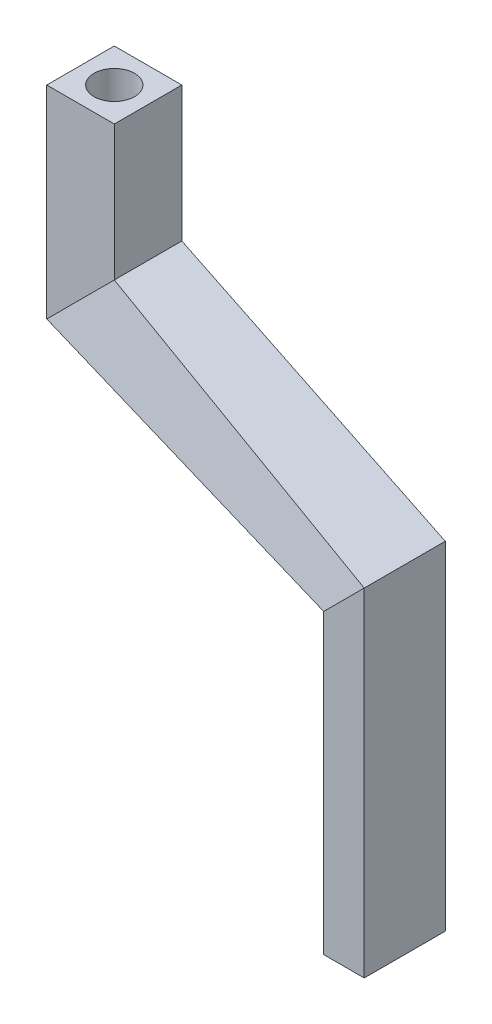
ISO-10303-21;
HEADER;
FILE_DESCRIPTION(('STEP AP214'),'2;1');
FILE_NAME('part.step','',(''),(''),'','','');
FILE_SCHEMA(('AUTOMOTIVE_DESIGN { 1 0 10303 214 1 1 1 1 }'));
ENDSEC;
DATA;
#1=APPLICATION_CONTEXT('core data for automotive mechanical design processes');
#2=APPLICATION_PROTOCOL_DEFINITION('international standard','automotive_design',2000,#1);
#3=PRODUCT_CONTEXT('',#1,'mechanical');
#4=PRODUCT('Part','Part','',(#3));
#5=PRODUCT_RELATED_PRODUCT_CATEGORY('part','',(#4));
#6=PRODUCT_DEFINITION_FORMATION('','',#4);
#7=PRODUCT_DEFINITION_CONTEXT('part definition',#1,'design');
#8=PRODUCT_DEFINITION('design','',#6,#7);
#9=PRODUCT_DEFINITION_SHAPE('','',#8);
#10=(LENGTH_UNIT() NAMED_UNIT(*) SI_UNIT(.MILLI.,.METRE.));
#11=(NAMED_UNIT(*) PLANE_ANGLE_UNIT() SI_UNIT($,.RADIAN.));
#12=(NAMED_UNIT(*) SI_UNIT($,.STERADIAN.) SOLID_ANGLE_UNIT());
#13=UNCERTAINTY_MEASURE_WITH_UNIT(LENGTH_MEASURE(1.E-05),#10,'distance_accuracy_value','');
#14=(GEOMETRIC_REPRESENTATION_CONTEXT(3) GLOBAL_UNCERTAINTY_ASSIGNED_CONTEXT((#13)) GLOBAL_UNIT_ASSIGNED_CONTEXT((#10,
#11,#12)) REPRESENTATION_CONTEXT('',''));
#15=CARTESIAN_POINT('',(0.,0.,0.));
#16=DIRECTION('',(0.,0.,1.));
#17=DIRECTION('',(1.,0.,0.));
#18=AXIS2_PLACEMENT_3D('',#15,#16,#17);
#19=CARTESIAN_POINT('',(0.,-20.,0.));
#20=DIRECTION('',(-1.,0.,0.));
#21=DIRECTION('',(0.,0.,-1.));
#22=AXIS2_PLACEMENT_3D('',#19,#20,#21);
#23=PLANE('',#22);
#24=DIRECTION('',(0.,0.,-1.));
#25=VECTOR('',#24,1.);
#26=CARTESIAN_POINT('',(0.,2.00000000000003,0.));
#27=LINE('',#26,#25);
#28=CARTESIAN_POINT('',(0.,2.00000000000003,0.));
#29=VERTEX_POINT('',#28);
#30=CARTESIAN_POINT('',(0.,2.00000000000003,6.));
#31=VERTEX_POINT('',#30);
#32=EDGE_CURVE('E127',#29,#31,#27,.F.);
#33=ORIENTED_EDGE('',*,*,#32,.F.);
#34=DIRECTION('',(0.,1.,0.));
#35=VECTOR('',#34,1.);
#36=CARTESIAN_POINT('',(0.,-20.,0.));
#37=LINE('',#36,#35);
#38=CARTESIAN_POINT('',(0.,-20.,0.));
#39=VERTEX_POINT('',#38);
#40=EDGE_CURVE('E120',#39,#29,#37,.T.);
#41=ORIENTED_EDGE('',*,*,#40,.F.);
#42=DIRECTION('',(0.,0.,-1.));
#43=VECTOR('',#42,1.);
#44=CARTESIAN_POINT('',(0.,-20.,0.));
#45=LINE('',#44,#43);
#46=CARTESIAN_POINT('',(0.,-20.,6.));
#47=VERTEX_POINT('',#46);
#48=EDGE_CURVE('E131',#47,#39,#45,.T.);
#49=ORIENTED_EDGE('',*,*,#48,.F.);
#50=DIRECTION('',(0.,1.,0.));
#51=VECTOR('',#50,1.);
#52=CARTESIAN_POINT('',(0.,-20.,6.));
#53=LINE('',#52,#51);
#54=EDGE_CURVE('E11',#47,#31,#53,.T.);
#55=ORIENTED_EDGE('',*,*,#54,.T.);
#56=EDGE_LOOP('',(#33,#41,#49,#55));
#57=FACE_BOUND('',#56,.T.);
#58=ADVANCED_FACE('F37',(#57),#23,.T.);
#59=CARTESIAN_POINT('',(0.,-20.,6.));
#60=DIRECTION('',(0.,0.,1.));
#61=DIRECTION('',(-1.,0.,0.));
#62=AXIS2_PLACEMENT_3D('',#59,#60,#61);
#63=PLANE('',#62);
#64=DIRECTION('',(-0.707106781186551,-0.707106781186544,0.));
#65=VECTOR('',#64,1.);
#66=CARTESIAN_POINT('',(3.,5.00000000000001,6.));
#67=LINE('',#66,#65);
#68=CARTESIAN_POINT('',(3.,5.,6.));
#69=VERTEX_POINT('',#68);
#70=EDGE_CURVE('E132',#69,#31,#67,.T.);
#71=ORIENTED_EDGE('',*,*,#70,.T.);
#72=ORIENTED_EDGE('',*,*,#54,.F.);
#73=DIRECTION('',(-1.,0.,0.));
#74=VECTOR('',#73,1.);
#75=CARTESIAN_POINT('',(0.,-20.,6.));
#76=LINE('',#75,#74);
#77=CARTESIAN_POINT('',(3.,-20.,6.));
#78=VERTEX_POINT('',#77);
#79=EDGE_CURVE('E105',#78,#47,#76,.T.);
#80=ORIENTED_EDGE('',*,*,#79,.F.);
#81=DIRECTION('',(0.,1.,0.));
#82=VECTOR('',#81,1.);
#83=CARTESIAN_POINT('',(3.,-20.,6.));
#84=LINE('',#83,#82);
#85=EDGE_CURVE('E46',#78,#69,#84,.T.);
#86=ORIENTED_EDGE('',*,*,#85,.T.);
#87=EDGE_LOOP('',(#71,#72,#80,#86));
#88=FACE_BOUND('',#87,.T.);
#89=ADVANCED_FACE('F118',(#88),#63,.T.);
#90=CARTESIAN_POINT('',(3.,-20.,0.));
#91=DIRECTION('',(1.,0.,0.));
#92=DIRECTION('',(0.,0.,1.));
#93=AXIS2_PLACEMENT_3D('',#90,#91,#92);
#94=PLANE('',#93);
#95=ORIENTED_EDGE('',*,*,#85,.F.);
#96=DIRECTION('',(0.,0.,1.));
#97=VECTOR('',#96,1.);
#98=CARTESIAN_POINT('',(3.,-20.,0.));
#99=LINE('',#98,#97);
#100=CARTESIAN_POINT('',(3.,-20.,0.));
#101=VERTEX_POINT('',#100);
#102=EDGE_CURVE('E100',#101,#78,#99,.T.);
#103=ORIENTED_EDGE('',*,*,#102,.F.);
#104=DIRECTION('',(0.,1.,0.));
#105=VECTOR('',#104,1.);
#106=CARTESIAN_POINT('',(3.,-20.,0.));
#107=LINE('',#106,#105);
#108=CARTESIAN_POINT('',(3.,5.,0.));
#109=VERTEX_POINT('',#108);
#110=EDGE_CURVE('E116',#101,#109,#107,.T.);
#111=ORIENTED_EDGE('',*,*,#110,.T.);
#112=DIRECTION('',(0.,0.,1.));
#113=VECTOR('',#112,1.);
#114=CARTESIAN_POINT('',(3.,5.,0.));
#115=LINE('',#114,#113);
#116=EDGE_CURVE('E114',#109,#69,#115,.T.);
#117=ORIENTED_EDGE('',*,*,#116,.T.);
#118=EDGE_LOOP('',(#95,#103,#111,#117));
#119=FACE_BOUND('',#118,.T.);
#120=ADVANCED_FACE('F113',(#119),#94,.T.);
#121=CARTESIAN_POINT('',(0.,-20.,0.));
#122=DIRECTION('',(0.,0.,-1.));
#123=DIRECTION('',(1.,0.,0.));
#124=AXIS2_PLACEMENT_3D('',#121,#122,#123);
#125=PLANE('',#124);
#126=DIRECTION('',(0.707106781186551,0.707106781186544,0.));
#127=VECTOR('',#126,1.);
#128=CARTESIAN_POINT('',(0.,2.00000000000003,0.));
#129=LINE('',#128,#127);
#130=EDGE_CURVE('E129',#29,#109,#129,.T.);
#131=ORIENTED_EDGE('',*,*,#130,.T.);
#132=ORIENTED_EDGE('',*,*,#110,.F.);
#133=DIRECTION('',(1.,0.,0.));
#134=VECTOR('',#133,1.);
#135=CARTESIAN_POINT('',(0.,-20.,0.));
#136=LINE('',#135,#134);
#137=EDGE_CURVE('E107',#39,#101,#136,.T.);
#138=ORIENTED_EDGE('',*,*,#137,.F.);
#139=ORIENTED_EDGE('',*,*,#40,.T.);
#140=EDGE_LOOP('',(#131,#132,#138,#139));
#141=FACE_BOUND('',#140,.T.);
#142=ADVANCED_FACE('F241',(#141),#125,.T.);
#143=CARTESIAN_POINT('',(0.,-20.,0.));
#144=DIRECTION('',(0.,-1.,0.));
#145=DIRECTION('',(0.,0.,1.));
#146=AXIS2_PLACEMENT_3D('',#143,#144,#145);
#147=PLANE('',#146);
#148=ORIENTED_EDGE('',*,*,#48,.T.);
#149=ORIENTED_EDGE('',*,*,#137,.T.);
#150=ORIENTED_EDGE('',*,*,#102,.T.);
#151=ORIENTED_EDGE('',*,*,#79,.T.);
#152=EDGE_LOOP('',(#148,#149,#150,#151));
#153=FACE_BOUND('',#152,.T.);
#154=ADVANCED_FACE('F103',(#153),#147,.T.);
#155=CARTESIAN_POINT('',(0.,2.00000000000003,0.));
#156=DIRECTION('',(0.151565848614554,-0.151565848614556,-0.976757691071588));
#157=DIRECTION('',(0.707106781186551,0.707106781186544,0.));
#158=AXIS2_PLACEMENT_3D('',#155,#156,#157);
#159=PLANE('',#158);
#160=ORIENTED_EDGE('',*,*,#130,.F.);
#161=CARTESIAN_POINT('',(0.,2.00000000000003,0.));
#162=CARTESIAN_POINT('',(-8.66666666666667,3.00000000000002,-1.49999999999998));
#163=CARTESIAN_POINT('',(-17.3333333333333,4.00000000000001,-2.99999999999996));
#164=CARTESIAN_POINT('',(-26.,5.,-4.49999999999993));
#165=B_SPLINE_CURVE_WITH_KNOTS('',3,(#161,#162,#163,#164),.UNSPECIFIED.,.F.,.F.,(4,4),(0.,1.),.UNSPECIFIED.);
#166=CARTESIAN_POINT('',(-26.,5.,-4.49999999999993));
#167=VERTEX_POINT('',#166);
#168=EDGE_CURVE('E63',#29,#167,#165,.T.);
#169=ORIENTED_EDGE('',*,*,#168,.T.);
#170=DIRECTION('',(-0.707106781186546,-0.707106781186549,0.));
#171=VECTOR('',#170,1.);
#172=CARTESIAN_POINT('',(-18.5,12.5,-4.49999999999994));
#173=LINE('',#172,#171);
#174=CARTESIAN_POINT('',(-21.,10.,-4.49999999999993));
#175=VERTEX_POINT('',#174);
#176=EDGE_CURVE('E145',#175,#167,#173,.T.);
#177=ORIENTED_EDGE('',*,*,#176,.F.);
#178=CARTESIAN_POINT('',(3.,5.,0.));
#179=CARTESIAN_POINT('',(-5.,6.66666666666667,-1.49999999999998));
#180=CARTESIAN_POINT('',(-13.,8.33333333333335,-2.99999999999996));
#181=CARTESIAN_POINT('',(-21.,10.,-4.49999999999993));
#182=B_SPLINE_CURVE_WITH_KNOTS('',3,(#178,#179,#180,#181),.UNSPECIFIED.,.F.,.F.,(4,4),(0.,1.),.UNSPECIFIED.);
#183=EDGE_CURVE('E243',#109,#175,#182,.T.);
#184=ORIENTED_EDGE('',*,*,#183,.F.);
#185=EDGE_LOOP('',(#160,#169,#177,#184));
#186=FACE_BOUND('',#185,.T.);
#187=ADVANCED_FACE('F211',(#186),#159,.T.);
#188=CARTESIAN_POINT('',(0.,2.00000000000003,6.));
#189=DIRECTION('',(-0.114624107985129,-0.993408935871131,0.));
#190=DIRECTION('',(0.,0.,-1.));
#191=AXIS2_PLACEMENT_3D('',#188,#189,#190);
#192=PLANE('',#191);
#193=ORIENTED_EDGE('',*,*,#32,.T.);
#194=CARTESIAN_POINT('',(0.,2.00000000000003,6.));
#195=CARTESIAN_POINT('',(-8.66666666666667,3.00000000000002,4.16666666666669));
#196=CARTESIAN_POINT('',(-17.3333333333333,4.00000000000001,2.33333333333338));
#197=CARTESIAN_POINT('',(-26.,5.,0.50000000000007));
#198=B_SPLINE_CURVE_WITH_KNOTS('',3,(#194,#195,#196,#197),.UNSPECIFIED.,.F.,.F.,(4,4),(0.,1.),.UNSPECIFIED.);
#199=CARTESIAN_POINT('',(-26.,5.,0.50000000000007));
#200=VERTEX_POINT('',#199);
#201=EDGE_CURVE('E54',#31,#200,#198,.T.);
#202=ORIENTED_EDGE('',*,*,#201,.T.);
#203=DIRECTION('',(0.,0.,-1.));
#204=VECTOR('',#203,1.);
#205=CARTESIAN_POINT('',(-26.,5.,0.));
#206=LINE('',#205,#204);
#207=EDGE_CURVE('E193',#200,#167,#206,.T.);
#208=ORIENTED_EDGE('',*,*,#207,.T.);
#209=ORIENTED_EDGE('',*,*,#168,.F.);
#210=EDGE_LOOP('',(#193,#202,#208,#209));
#211=FACE_BOUND('',#210,.T.);
#212=ADVANCED_FACE('F220',(#211),#192,.T.);
#213=CARTESIAN_POINT('',(3.,5.,6.));
#214=DIRECTION('',(-0.183180746262922,0.183180746262924,0.965862116659059));
#215=DIRECTION('',(-0.707106781186551,-0.707106781186544,0.));
#216=AXIS2_PLACEMENT_3D('',#213,#214,#215);
#217=PLANE('',#216);
#218=ORIENTED_EDGE('',*,*,#70,.F.);
#219=CARTESIAN_POINT('',(3.,5.,6.));
#220=CARTESIAN_POINT('',(-5.,6.66666666666668,4.16666666666669));
#221=CARTESIAN_POINT('',(-13.,8.33333333333335,2.33333333333338));
#222=CARTESIAN_POINT('',(-21.,10.,0.500000000000065));
#223=B_SPLINE_CURVE_WITH_KNOTS('',3,(#219,#220,#221,#222),.UNSPECIFIED.,.F.,.F.,(4,4),(0.,1.),.UNSPECIFIED.);
#224=CARTESIAN_POINT('',(-21.,10.,0.50000000000007));
#225=VERTEX_POINT('',#224);
#226=EDGE_CURVE('E81',#69,#225,#223,.T.);
#227=ORIENTED_EDGE('',*,*,#226,.T.);
#228=DIRECTION('',(0.707106781186546,0.707106781186549,0.));
#229=VECTOR('',#228,1.);
#230=CARTESIAN_POINT('',(-18.5,12.5,0.500000000000064));
#231=LINE('',#230,#229);
#232=EDGE_CURVE('E40',#200,#225,#231,.T.);
#233=ORIENTED_EDGE('',*,*,#232,.F.);
#234=ORIENTED_EDGE('',*,*,#201,.F.);
#235=EDGE_LOOP('',(#218,#227,#233,#234));
#236=FACE_BOUND('',#235,.T.);
#237=ADVANCED_FACE('F223',(#236),#217,.T.);
#238=CARTESIAN_POINT('',(3.,5.,0.));
#239=DIRECTION('',(0.203954254112002,0.978980419737605,0.));
#240=DIRECTION('',(0.,0.,1.));
#241=AXIS2_PLACEMENT_3D('',#238,#239,#240);
#242=PLANE('',#241);
#243=ORIENTED_EDGE('',*,*,#116,.F.);
#244=ORIENTED_EDGE('',*,*,#183,.T.);
#245=DIRECTION('',(0.,0.,1.));
#246=VECTOR('',#245,1.);
#247=CARTESIAN_POINT('',(-21.,10.,-80.7623750246238));
#248=LINE('',#247,#246);
#249=EDGE_CURVE('E199',#175,#225,#248,.T.);
#250=ORIENTED_EDGE('',*,*,#249,.T.);
#251=ORIENTED_EDGE('',*,*,#226,.F.);
#252=EDGE_LOOP('',(#243,#244,#250,#251));
#253=FACE_BOUND('',#252,.T.);
#254=ADVANCED_FACE('F227',(#253),#242,.T.);
#255=CARTESIAN_POINT('',(-26.,20.,0.500000000000067));
#256=DIRECTION('',(-1.,0.,0.));
#257=DIRECTION('',(0.,0.,-1.));
#258=AXIS2_PLACEMENT_3D('',#255,#256,#257);
#259=PLANE('',#258);
#260=DIRECTION('',(0.,-1.,0.));
#261=VECTOR('',#260,1.);
#262=CARTESIAN_POINT('',(-26.,20.,0.500000000000067));
#263=LINE('',#262,#261);
#264=CARTESIAN_POINT('',(-26.,20.,0.500000000000067));
#265=VERTEX_POINT('',#264);
#266=EDGE_CURVE('E181',#265,#200,#263,.T.);
#267=ORIENTED_EDGE('',*,*,#266,.F.);
#268=DIRECTION('',(0.,0.,1.));
#269=VECTOR('',#268,1.);
#270=CARTESIAN_POINT('',(-26.,20.,0.500000000000067));
#271=LINE('',#270,#269);
#272=CARTESIAN_POINT('',(-26.,20.,-4.49999999999993));
#273=VERTEX_POINT('',#272);
#274=EDGE_CURVE('E295',#273,#265,#271,.T.);
#275=ORIENTED_EDGE('',*,*,#274,.F.);
#276=DIRECTION('',(0.,-1.,0.));
#277=VECTOR('',#276,1.);
#278=CARTESIAN_POINT('',(-26.,20.,-4.49999999999993));
#279=LINE('',#278,#277);
#280=EDGE_CURVE('E92',#273,#167,#279,.T.);
#281=ORIENTED_EDGE('',*,*,#280,.T.);
#282=ORIENTED_EDGE('',*,*,#207,.F.);
#283=EDGE_LOOP('',(#267,#275,#281,#282));
#284=FACE_BOUND('',#283,.T.);
#285=ADVANCED_FACE('F162',(#284),#259,.T.);
#286=CARTESIAN_POINT('',(-26.,20.,-4.49999999999993));
#287=DIRECTION('',(0.,0.,-1.));
#288=DIRECTION('',(1.,0.,0.));
#289=AXIS2_PLACEMENT_3D('',#286,#287,#288);
#290=PLANE('',#289);
#291=ORIENTED_EDGE('',*,*,#176,.T.);
#292=ORIENTED_EDGE('',*,*,#280,.F.);
#293=DIRECTION('',(-1.,0.,0.));
#294=VECTOR('',#293,1.);
#295=CARTESIAN_POINT('',(-26.,20.,-4.49999999999993));
#296=LINE('',#295,#294);
#297=CARTESIAN_POINT('',(-21.,20.,-4.49999999999993));
#298=VERTEX_POINT('',#297);
#299=EDGE_CURVE('E190',#298,#273,#296,.T.);
#300=ORIENTED_EDGE('',*,*,#299,.F.);
#301=DIRECTION('',(0.,-1.,0.));
#302=VECTOR('',#301,1.);
#303=CARTESIAN_POINT('',(-21.,20.,-4.49999999999993));
#304=LINE('',#303,#302);
#305=EDGE_CURVE('E137',#298,#175,#304,.T.);
#306=ORIENTED_EDGE('',*,*,#305,.T.);
#307=EDGE_LOOP('',(#291,#292,#300,#306));
#308=FACE_BOUND('',#307,.T.);
#309=ADVANCED_FACE('F151',(#308),#290,.T.);
#310=CARTESIAN_POINT('',(-21.,20.,0.500000000000065));
#311=DIRECTION('',(1.,0.,0.));
#312=DIRECTION('',(0.,0.,1.));
#313=AXIS2_PLACEMENT_3D('',#310,#311,#312);
#314=PLANE('',#313);
#315=ORIENTED_EDGE('',*,*,#249,.F.);
#316=ORIENTED_EDGE('',*,*,#305,.F.);
#317=DIRECTION('',(0.,0.,-1.));
#318=VECTOR('',#317,1.);
#319=CARTESIAN_POINT('',(-21.,20.,0.500000000000065));
#320=LINE('',#319,#318);
#321=CARTESIAN_POINT('',(-21.,20.,0.500000000000065));
#322=VERTEX_POINT('',#321);
#323=EDGE_CURVE('E291',#322,#298,#320,.T.);
#324=ORIENTED_EDGE('',*,*,#323,.F.);
#325=DIRECTION('',(0.,-1.,0.));
#326=VECTOR('',#325,1.);
#327=CARTESIAN_POINT('',(-21.,20.,0.500000000000065));
#328=LINE('',#327,#326);
#329=EDGE_CURVE('E189',#322,#225,#328,.T.);
#330=ORIENTED_EDGE('',*,*,#329,.T.);
#331=EDGE_LOOP('',(#315,#316,#324,#330));
#332=FACE_BOUND('',#331,.T.);
#333=ADVANCED_FACE('F161',(#332),#314,.T.);
#334=CARTESIAN_POINT('',(-26.,20.,0.500000000000067));
#335=DIRECTION('',(0.,0.,1.));
#336=DIRECTION('',(-1.,0.,0.));
#337=AXIS2_PLACEMENT_3D('',#334,#335,#336);
#338=PLANE('',#337);
#339=ORIENTED_EDGE('',*,*,#232,.T.);
#340=ORIENTED_EDGE('',*,*,#329,.F.);
#341=DIRECTION('',(1.,0.,0.));
#342=VECTOR('',#341,1.);
#343=CARTESIAN_POINT('',(-26.,20.,0.500000000000067));
#344=LINE('',#343,#342);
#345=EDGE_CURVE('E297',#265,#322,#344,.T.);
#346=ORIENTED_EDGE('',*,*,#345,.F.);
#347=ORIENTED_EDGE('',*,*,#266,.T.);
#348=EDGE_LOOP('',(#339,#340,#346,#347));
#349=FACE_BOUND('',#348,.T.);
#350=ADVANCED_FACE('F167',(#349),#338,.T.);
#351=CARTESIAN_POINT('',(0.,20.,0.));
#352=DIRECTION('',(0.,1.,0.));
#353=DIRECTION('',(0.,0.,-1.));
#354=AXIS2_PLACEMENT_3D('',#351,#352,#353);
#355=PLANE('',#354);
#356=CARTESIAN_POINT('',(-23.5,20.,-1.99999999999993));
#357=DIRECTION('',(0.,1.,0.));
#358=DIRECTION('',(0.,0.,1.));
#359=AXIS2_PLACEMENT_3D('',#356,#357,#358);
#360=CIRCLE('',#359,1.5);
#361=CARTESIAN_POINT('',(-23.5,20.,-0.499999999999933));
#362=VERTEX_POINT('',#361);
#363=EDGE_CURVE('E298',#362,#362,#360,.T.);
#364=ORIENTED_EDGE('',*,*,#363,.F.);
#365=EDGE_LOOP('',(#364));
#366=FACE_BOUND('',#365,.T.);
#367=ORIENTED_EDGE('',*,*,#274,.T.);
#368=ORIENTED_EDGE('',*,*,#345,.T.);
#369=ORIENTED_EDGE('',*,*,#323,.T.);
#370=ORIENTED_EDGE('',*,*,#299,.T.);
#371=EDGE_LOOP('',(#367,#368,#369,#370));
#372=FACE_BOUND('',#371,.T.);
#373=ADVANCED_FACE('F163',(#366,#372),#355,.T.);
#374=CARTESIAN_POINT('',(-23.5,20.,-1.99999999999993));
#375=DIRECTION('',(0.,-1.,0.));
#376=DIRECTION('',(0.,0.,1.));
#377=AXIS2_PLACEMENT_3D('',#374,#375,#376);
#378=CYLINDRICAL_SURFACE('',#377,1.5);
#379=ORIENTED_EDGE('',*,*,#363,.T.);
#380=EDGE_LOOP('',(#379));
#381=FACE_BOUND('',#380,.T.);
#382=CARTESIAN_POINT('',(-23.5,15.,-1.99999999999993));
#383=DIRECTION('',(0.,1.,0.));
#384=DIRECTION('',(0.,0.,1.));
#385=AXIS2_PLACEMENT_3D('',#382,#383,#384);
#386=CIRCLE('',#385,1.5);
#387=CARTESIAN_POINT('',(-23.5,15.,-0.499999999999933));
#388=VERTEX_POINT('',#387);
#389=EDGE_CURVE('E302',#388,#388,#386,.T.);
#390=ORIENTED_EDGE('',*,*,#389,.F.);
#391=EDGE_LOOP('',(#390));
#392=FACE_BOUND('',#391,.T.);
#393=ADVANCED_FACE('F311',(#381,#392),#378,.F.);
#394=CARTESIAN_POINT('',(0.,15.,0.));
#395=DIRECTION('',(0.,-1.,0.));
#396=DIRECTION('',(0.,0.,1.));
#397=AXIS2_PLACEMENT_3D('',#394,#395,#396);
#398=PLANE('',#397);
#399=ORIENTED_EDGE('',*,*,#389,.T.);
#400=EDGE_LOOP('',(#399));
#401=FACE_BOUND('',#400,.T.);
#402=ADVANCED_FACE('F309',(#401),#398,.F.);
#403=CLOSED_SHELL('',(#58,#89,#120,#142,#154,#187,#212,#237,#254,#285,#309,#333,#350,#373,#393,#402));
#404=MANIFOLD_SOLID_BREP('B2',#403);
#405=ADVANCED_BREP_SHAPE_REPRESENTATION('',(#18,#404),#14);
#406=SHAPE_DEFINITION_REPRESENTATION(#9,#405);
ENDSEC;
END-ISO-10303-21;
